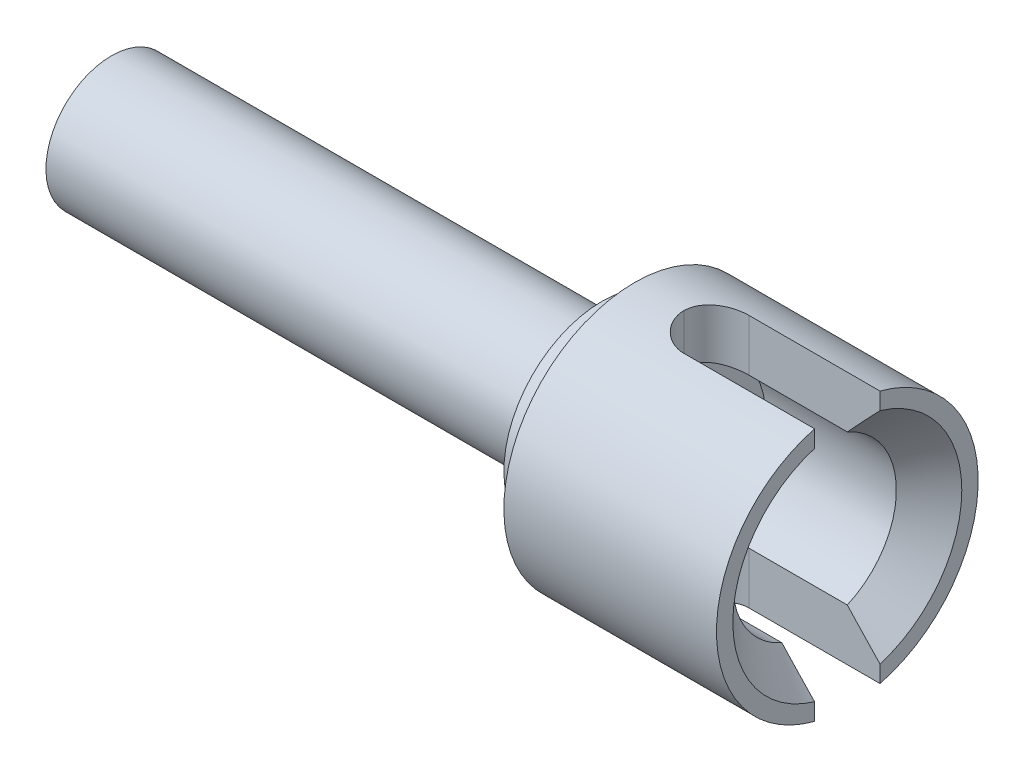
ISO-10303-21;
HEADER;
FILE_DESCRIPTION(('STEP AP214'),'2;1');
FILE_NAME('part.step','',(''),(''),'','','');
FILE_SCHEMA(('AUTOMOTIVE_DESIGN { 1 0 10303 214 1 1 1 1 }'));
ENDSEC;
DATA;
#1=APPLICATION_CONTEXT('core data for automotive mechanical design processes');
#2=APPLICATION_PROTOCOL_DEFINITION('international standard','automotive_design',2000,#1);
#3=PRODUCT_CONTEXT('',#1,'mechanical');
#4=PRODUCT('Part','Part','',(#3));
#5=PRODUCT_RELATED_PRODUCT_CATEGORY('part','',(#4));
#6=PRODUCT_DEFINITION_FORMATION('','',#4);
#7=PRODUCT_DEFINITION_CONTEXT('part definition',#1,'design');
#8=PRODUCT_DEFINITION('design','',#6,#7);
#9=PRODUCT_DEFINITION_SHAPE('','',#8);
#10=(LENGTH_UNIT() NAMED_UNIT(*) SI_UNIT(.MILLI.,.METRE.));
#11=(NAMED_UNIT(*) PLANE_ANGLE_UNIT() SI_UNIT($,.RADIAN.));
#12=(NAMED_UNIT(*) SI_UNIT($,.STERADIAN.) SOLID_ANGLE_UNIT());
#13=UNCERTAINTY_MEASURE_WITH_UNIT(LENGTH_MEASURE(1.E-05),#10,'distance_accuracy_value','');
#14=(GEOMETRIC_REPRESENTATION_CONTEXT(3) GLOBAL_UNCERTAINTY_ASSIGNED_CONTEXT((#13)) GLOBAL_UNIT_ASSIGNED_CONTEXT((#10,
#11,#12)) REPRESENTATION_CONTEXT('',''));
#15=CARTESIAN_POINT('',(0.,0.,0.));
#16=DIRECTION('',(0.,0.,1.));
#17=DIRECTION('',(1.,0.,0.));
#18=AXIS2_PLACEMENT_3D('',#15,#16,#17);
#19=CARTESIAN_POINT('',(0.,0.,0.));
#20=DIRECTION('',(1.,0.,0.));
#21=DIRECTION('',(0.,1.,0.));
#22=AXIS2_PLACEMENT_3D('',#19,#20,#21);
#23=CYLINDRICAL_SURFACE('',#22,3.96875);
#24=DIRECTION('',(1.,0.,0.));
#25=VECTOR('',#24,1.);
#26=CARTESIAN_POINT('',(0.,-3.6374194578712,-1.5875));
#27=LINE('',#26,#25);
#28=CARTESIAN_POINT('',(3.96875,-3.6374194578712,-1.5875));
#29=VERTEX_POINT('',#28);
#30=CARTESIAN_POINT('',(8.73125,-3.6374194578712,-1.5875));
#31=VERTEX_POINT('',#30);
#32=EDGE_CURVE('E378',#29,#31,#27,.T.);
#33=ORIENTED_EDGE('',*,*,#32,.T.);
#34=CARTESIAN_POINT('',(8.73125,0.,0.));
#35=DIRECTION('',(-1.,0.,0.));
#36=DIRECTION('',(0.,-1.,0.));
#37=AXIS2_PLACEMENT_3D('',#34,#35,#36);
#38=CIRCLE('',#37,3.96875);
#39=CARTESIAN_POINT('',(8.73125,3.6374194578712,-1.5875));
#40=VERTEX_POINT('',#39);
#41=EDGE_CURVE('E319',#31,#40,#38,.F.);
#42=ORIENTED_EDGE('',*,*,#41,.T.);
#43=DIRECTION('',(1.,0.,0.));
#44=VECTOR('',#43,1.);
#45=CARTESIAN_POINT('',(0.,3.6374194578712,-1.5875));
#46=LINE('',#45,#44);
#47=CARTESIAN_POINT('',(3.96875,3.6374194578712,-1.5875));
#48=VERTEX_POINT('',#47);
#49=EDGE_CURVE('E377',#40,#48,#46,.F.);
#50=ORIENTED_EDGE('',*,*,#49,.T.);
#51=CARTESIAN_POINT('',(3.96875,3.6374194578712,-1.5875));
#52=CARTESIAN_POINT('',(3.92602810243465,3.63741383962096,-1.58750184812125));
#53=CARTESIAN_POINT('',(3.88332875869303,3.63817306486479,-1.58577432279343));
#54=CARTESIAN_POINT('',(3.79827459184285,3.64116511612365,-1.57889657712954));
#55=CARTESIAN_POINT('',(3.75591964368906,3.64339738067565,-1.57374766088416));
#56=CARTESIAN_POINT('',(3.6301813006015,3.65219188533386,-1.55328759601412));
#57=CARTESIAN_POINT('',(3.54770244852725,3.6608529363275,-1.53296229854883));
#58=CARTESIAN_POINT('',(3.38771317198106,3.68267853067419,-1.47975273463246));
#59=CARTESIAN_POINT('',(3.31019777157339,3.69583847715174,-1.44688128359683));
#60=CARTESIAN_POINT('',(3.16168861789508,3.72516580069995,-1.36960620090599));
#61=CARTESIAN_POINT('',(3.09070141677396,3.74133615104774,-1.3251911506894));
#62=CARTESIAN_POINT('',(2.95333133987929,3.77587660433763,-1.22342125957965));
#63=CARTESIAN_POINT('',(2.8873713436787,3.79431699293091,-1.16551959183532));
#64=CARTESIAN_POINT('',(2.76579244450964,3.83073862499475,-1.03957293948962));
#65=CARTESIAN_POINT('',(2.71017590752935,3.84871976260567,-0.971525640549356));
#66=CARTESIAN_POINT('',(2.60871506921386,3.88305820620028,-0.823891813808964));
#67=CARTESIAN_POINT('',(2.56334886385573,3.89932217227142,-0.743953356852592));
#68=CARTESIAN_POINT('',(2.48691833069168,3.9275159204731,-0.576846311618418));
#69=CARTESIAN_POINT('',(2.45583777186154,3.93945061815173,-0.489686062187027));
#70=CARTESIAN_POINT('',(2.41558822057406,3.95510835037269,-0.335207512549659));
#71=CARTESIAN_POINT('',(2.4027552754563,3.96018317246006,-0.268959916670227));
#72=CARTESIAN_POINT('',(2.38556826068598,3.96702274934214,-0.135159667180418));
#73=CARTESIAN_POINT('',(2.38122051324627,3.96878503597282,-0.0676060783084545));
#74=CARTESIAN_POINT('',(2.38125,3.96875,0.));
#75=B_SPLINE_CURVE_WITH_KNOTS('',3,(#51,#52,#53,#54,#55,#56,#57,#58,#59,#60,#61,#62,#63,#64,#65,
#66,#67,#68,#69,#70,#71,#72,#73,#74),.UNSPECIFIED.,.F.,.F.,(4,2,2,2,2,2,2,2,2,2,2,4),(0.,
0.128080398698314,0.256112006503549,0.510926642824228,0.765481689339862,1.02028949833636,
1.28816597634386,1.55610365391027,1.83472528824556,2.1130295717501,2.3154412151602,
2.51800361542009),.UNSPECIFIED.);
#76=CARTESIAN_POINT('',(2.38125,3.96875,0.));
#77=VERTEX_POINT('',#76);
#78=EDGE_CURVE('E311',#48,#77,#75,.T.);
#79=ORIENTED_EDGE('',*,*,#78,.T.);
#80=CARTESIAN_POINT('',(2.38125,0.,0.));
#81=DIRECTION('',(1.,0.,0.));
#82=DIRECTION('',(0.,1.,0.));
#83=AXIS2_PLACEMENT_3D('',#80,#81,#82);
#84=CIRCLE('',#83,3.96875);
#85=CARTESIAN_POINT('',(2.38125,-3.96875,0.));
#86=VERTEX_POINT('',#85);
#87=EDGE_CURVE('E185',#86,#77,#84,.T.);
#88=ORIENTED_EDGE('',*,*,#87,.F.);
#89=CARTESIAN_POINT('',(2.38125,-3.96875,0.));
#90=CARTESIAN_POINT('',(2.38124851790412,-3.96875369516103,-0.0428607001451946));
#91=CARTESIAN_POINT('',(2.38298693483415,-3.96805488344218,-0.0856993556853991));
#92=CARTESIAN_POINT('',(2.38991045081292,-3.96529188571283,-0.171040382183681));
#93=CARTESIAN_POINT('',(2.3950945284199,-3.96322810433883,-0.213542849025273));
#94=CARTESIAN_POINT('',(2.41570683559488,-3.95507196393478,-0.33977664728298));
#95=CARTESIAN_POINT('',(2.43619582781275,-3.94701410018382,-0.422614387160559));
#96=CARTESIAN_POINT('',(2.48988075452175,-3.92648272405839,-0.583344848198205));
#97=CARTESIAN_POINT('',(2.52306836379832,-3.91401210508868,-0.66124077029055));
#98=CARTESIAN_POINT('',(2.60108469387746,-3.88587265499136,-0.810392331117243));
#99=CARTESIAN_POINT('',(2.64592212343718,-3.87020143315429,-0.881642947809557));
#100=CARTESIAN_POINT('',(2.74815065020465,-3.83643853017265,-1.01878220140519));
#101=CARTESIAN_POINT('',(2.80599332819521,-3.81827240559974,-1.08431551324055));
#102=CARTESIAN_POINT('',(2.93164012097266,-3.78190483541745,-1.20505386735368));
#103=CARTESIAN_POINT('',(2.9994485860561,-3.76370337782587,-1.26025437507542));
#104=CARTESIAN_POINT('',(3.14679708956617,-3.72841676012464,-1.36120480857947));
#105=CARTESIAN_POINT('',(3.22672776891809,-3.7114187071445,-1.4064175944854));
#106=CARTESIAN_POINT('',(3.39379414047564,-3.681666742486,-1.48256038380695));
#107=CARTESIAN_POINT('',(3.48091970578923,-3.6689069883162,-1.51351007189968));
#108=CARTESIAN_POINT('',(3.63506055428717,-3.65212863509287,-1.55347251642303));
#109=CARTESIAN_POINT('',(3.70097950525157,-3.64666886628739,-1.56618395241635));
#110=CARTESIAN_POINT('',(3.83416144805477,-3.63928843788904,-1.5832179371524));
#111=CARTESIAN_POINT('',(3.90142593644765,-3.63737196913539,-1.58753055250852));
#112=CARTESIAN_POINT('',(3.96875,-3.6374194578712,-1.5875));
#113=B_SPLINE_CURVE_WITH_KNOTS('',3,(#89,#90,#91,#92,#93,#94,#95,#96,#97,#98,#99,#100,#101,#102,
#103,#104,#105,#106,#107,#108,#109,#110,#111,#112),.UNSPECIFIED.,.F.,.F.,(4,2,2,2,2,2,2,2,2,2,2,
4),(0.,0.128498216049018,0.256958356688971,0.51275394239543,0.768382115034419,1.02420193363494,
1.290865946481,1.55764671199365,1.83643414135596,2.11483565193651,2.31630002858557,
2.51800253522898),.UNSPECIFIED.);
#114=EDGE_CURVE('E236',#86,#29,#113,.T.);
#115=ORIENTED_EDGE('',*,*,#114,.T.);
#116=EDGE_LOOP('',(#33,#42,#50,#79,#88,#115));
#117=FACE_BOUND('',#116,.T.);
#118=ADVANCED_FACE('F50',(#117),#23,.F.);
#119=CARTESIAN_POINT('',(10.31875,0.,0.));
#120=DIRECTION('',(-1.,0.,0.));
#121=DIRECTION('',(0.,-1.,0.));
#122=AXIS2_PLACEMENT_3D('',#119,#120,#121);
#123=PLANE('',#122);
#124=DIRECTION('',(0.,1.,0.));
#125=VECTOR('',#124,1.);
#126=CARTESIAN_POINT('',(10.31875,-6.35,-1.5875));
#127=LINE('',#126,#125);
#128=CARTESIAN_POINT('',(10.31875,5.32463687142138,-1.5875));
#129=VERTEX_POINT('',#128);
#130=CARTESIAN_POINT('',(10.31875,6.14836106210428,-1.5875));
#131=VERTEX_POINT('',#130);
#132=EDGE_CURVE('E179',#129,#131,#127,.T.);
#133=ORIENTED_EDGE('',*,*,#132,.F.);
#134=CARTESIAN_POINT('',(10.31875,0.,0.));
#135=DIRECTION('',(-1.,0.,0.));
#136=DIRECTION('',(0.,-1.,0.));
#137=AXIS2_PLACEMENT_3D('',#134,#135,#136);
#138=CIRCLE('',#137,5.55625000000001);
#139=CARTESIAN_POINT('',(10.31875,-5.32463687142138,-1.5875));
#140=VERTEX_POINT('',#139);
#141=EDGE_CURVE('E338',#129,#140,#138,.T.);
#142=ORIENTED_EDGE('',*,*,#141,.T.);
#143=CARTESIAN_POINT('',(10.31875,-6.14836106210428,-1.5875));
#144=VERTEX_POINT('',#143);
#145=EDGE_CURVE('E369',#144,#140,#127,.T.);
#146=ORIENTED_EDGE('',*,*,#145,.F.);
#147=CARTESIAN_POINT('',(10.31875,0.,0.));
#148=DIRECTION('',(1.,0.,0.));
#149=DIRECTION('',(0.,1.,0.));
#150=AXIS2_PLACEMENT_3D('',#147,#148,#149);
#151=CIRCLE('',#150,6.35);
#152=EDGE_CURVE('E186',#144,#131,#151,.T.);
#153=ORIENTED_EDGE('',*,*,#152,.T.);
#154=EDGE_LOOP('',(#133,#142,#146,#153));
#155=FACE_BOUND('',#154,.T.);
#156=ADVANCED_FACE('F405',(#155),#123,.F.);
#157=CARTESIAN_POINT('',(0.,0.,0.));
#158=DIRECTION('',(1.,0.,0.));
#159=DIRECTION('',(0.,1.,0.));
#160=AXIS2_PLACEMENT_3D('',#157,#158,#159);
#161=CYLINDRICAL_SURFACE('',#160,6.35);
#162=CARTESIAN_POINT('',(0.,0.,0.));
#163=DIRECTION('',(1.,0.,0.));
#164=DIRECTION('',(0.,1.,0.));
#165=AXIS2_PLACEMENT_3D('',#162,#163,#164);
#166=CIRCLE('',#165,6.35);
#167=CARTESIAN_POINT('',(0.,6.35,0.));
#168=VERTEX_POINT('',#167);
#169=EDGE_CURVE('E193',#168,#168,#166,.T.);
#170=ORIENTED_EDGE('',*,*,#169,.T.);
#171=EDGE_LOOP('',(#170));
#172=FACE_BOUND('',#171,.T.);
#173=DIRECTION('',(1.,0.,0.));
#174=VECTOR('',#173,1.);
#175=CARTESIAN_POINT('',(0.,6.14836106210428,-1.5875));
#176=LINE('',#175,#174);
#177=CARTESIAN_POINT('',(3.96875,6.14836106210428,-1.5875));
#178=VERTEX_POINT('',#177);
#179=EDGE_CURVE('E173',#131,#178,#176,.F.);
#180=ORIENTED_EDGE('',*,*,#179,.F.);
#181=ORIENTED_EDGE('',*,*,#152,.F.);
#182=DIRECTION('',(1.,0.,0.));
#183=VECTOR('',#182,1.);
#184=CARTESIAN_POINT('',(0.,-6.14836106210428,-1.5875));
#185=LINE('',#184,#183);
#186=CARTESIAN_POINT('',(3.96875,-6.14836106210428,-1.5875));
#187=VERTEX_POINT('',#186);
#188=EDGE_CURVE('E174',#187,#144,#185,.T.);
#189=ORIENTED_EDGE('',*,*,#188,.F.);
#190=CARTESIAN_POINT('',(3.96875,-6.14836106210428,-1.5875));
#191=CARTESIAN_POINT('',(3.92483359574141,-6.14835810796606,-1.58750053563076));
#192=CARTESIAN_POINT('',(3.88093895137328,-6.1488321882052,-1.58567649135611));
#193=CARTESIAN_POINT('',(3.79347796767349,-6.15070388893621,-1.57840509610179));
#194=CARTESIAN_POINT('',(3.74991157430941,-6.15210135391809,-1.57295835523029));
#195=CARTESIAN_POINT('',(3.62036259143335,-6.15762251223385,-1.55126429791882));
#196=CARTESIAN_POINT('',(3.53527018927444,-6.16307532290946,-1.52966278974207));
#197=CARTESIAN_POINT('',(3.37006582243951,-6.17688972981619,-1.47287988261591));
#198=CARTESIAN_POINT('',(3.28995347620758,-6.18525110287803,-1.43769952552689));
#199=CARTESIAN_POINT('',(3.13672525829143,-6.20393595252303,-1.35479829949003));
#200=CARTESIAN_POINT('',(3.06361148021027,-6.2142600134982,-1.30707369385797));
#201=CARTESIAN_POINT('',(2.92490015578896,-6.23595799608254,-1.19933256749028));
#202=CARTESIAN_POINT('',(2.85947866574726,-6.24734856924931,-1.13909280637801));
#203=CARTESIAN_POINT('',(2.7395469754307,-6.26975322519149,-1.0085018185416));
#204=CARTESIAN_POINT('',(2.68503884552563,-6.2807672362014,-0.938148677552538));
#205=CARTESIAN_POINT('',(2.58775247205585,-6.30136480507554,-0.788105723384307));
#206=CARTESIAN_POINT('',(2.54515208556795,-6.31092579003165,-0.708297348786836));
#207=CARTESIAN_POINT('',(2.47406156240866,-6.3273403202671,-0.542394374747512));
#208=CARTESIAN_POINT('',(2.44556051978103,-6.33419595732182,-0.456304693284594));
#209=CARTESIAN_POINT('',(2.41020807405795,-6.34280700011213,-0.308130870380592));
#210=CARTESIAN_POINT('',(2.3993655520536,-6.34548862203841,-0.247023133427682));
#211=CARTESIAN_POINT('',(2.38488205167632,-6.34909193923034,-0.123954377077036));
#212=CARTESIAN_POINT('',(2.38123594177495,-6.35001488853225,-0.0619939974411772));
#213=CARTESIAN_POINT('',(2.38125,-6.35,0.));
#214=B_SPLINE_CURVE_WITH_KNOTS('',3,(#190,#191,#192,#193,#194,#195,#196,#197,#198,#199,#200,
#201,#202,#203,#204,#205,#206,#207,#208,#209,#210,#211,#212,#213),.UNSPECIFIED.,.F.,.F.,(4,2,2,
2,2,2,2,2,2,2,2,4),(0.,0.13166598487826,0.26330980114286,0.525827589053102,0.788325238840122,
1.05090117028931,1.31864004112946,1.58642965659115,1.8580279681483,2.12941586644515,
2.31535338877351,2.50115827710588),.UNSPECIFIED.);
#215=CARTESIAN_POINT('',(2.38125,-6.35,0.));
#216=VERTEX_POINT('',#215);
#217=EDGE_CURVE('E245',#187,#216,#214,.T.);
#218=ORIENTED_EDGE('',*,*,#217,.T.);
#219=CARTESIAN_POINT('',(2.38125,-6.35,0.));
#220=CARTESIAN_POINT('',(2.38124952268289,-6.35000250540312,0.0439381419439145));
#221=CARTESIAN_POINT('',(2.38307531831141,-6.34954340403385,0.0878545966592351));
#222=CARTESIAN_POINT('',(2.390354068651,-6.3477286591364,0.175360439570218));
#223=CARTESIAN_POINT('',(2.39580645883683,-6.34637315514479,0.218949877602367));
#224=CARTESIAN_POINT('',(2.41752498623497,-6.34101201422057,0.34857618129887));
#225=CARTESIAN_POINT('',(2.43915282195388,-6.33571144551056,0.433724473320642));
#226=CARTESIAN_POINT('',(2.49601231471049,-6.32222636565126,0.599043829778521));
#227=CARTESIAN_POINT('',(2.53124369810381,-6.31404191251351,0.679214994295193));
#228=CARTESIAN_POINT('',(2.61426426878136,-6.29566048497806,0.832540768645135));
#229=CARTESIAN_POINT('',(2.66205673278726,-6.28546298562404,0.905693540832323));
#230=CARTESIAN_POINT('',(2.76986778510801,-6.26393073756775,1.0443626413639));
#231=CARTESIAN_POINT('',(2.83009429334061,-6.25257857860382,1.1097145404664));
#232=CARTESIAN_POINT('',(2.96062985433904,-6.23013032507566,1.22951149389981));
#233=CARTESIAN_POINT('',(3.03094113399481,-6.21903428769736,1.28395413289799));
#234=CARTESIAN_POINT('',(3.18094397253101,-6.19817637949513,1.3811687665937));
#235=CARTESIAN_POINT('',(3.26076136908793,-6.18843723686723,1.42375170417231));
#236=CARTESIAN_POINT('',(3.42668191006407,-6.17166052854814,1.49480670969855));
#237=CARTESIAN_POINT('',(3.51277990734533,-6.164620779582,1.52329018676586));
#238=CARTESIAN_POINT('',(3.6609060463689,-6.15576968025138,1.55859600850025));
#239=CARTESIAN_POINT('',(3.72195378400178,-6.15300939882428,1.56941770251178));
#240=CARTESIAN_POINT('',(3.84490665813771,-6.14929724452326,1.58387443533482));
#241=CARTESIAN_POINT('',(3.90681120670851,-6.14834418804682,1.58751417787204));
#242=CARTESIAN_POINT('',(3.96875,-6.14836106210428,1.5875));
#243=B_SPLINE_CURVE_WITH_KNOTS('',3,(#219,#220,#221,#222,#223,#224,#225,#226,#227,#228,#229,
#230,#231,#232,#233,#234,#235,#236,#237,#238,#239,#240,#241,#242),.UNSPECIFIED.,.F.,.F.,(4,2,2,
2,2,2,2,2,2,2,2,4),(0.,0.131731399473639,0.263442298089414,0.526113689422091,0.788779797220858,
1.05151449302482,1.31906192516595,1.58666852757008,1.85832436810619,2.1297600270756,
2.31551982828807,2.50115792810002),.UNSPECIFIED.);
#244=CARTESIAN_POINT('',(3.96875,-6.14836106210428,1.5875));
#245=VERTEX_POINT('',#244);
#246=EDGE_CURVE('E170',#216,#245,#243,.T.);
#247=ORIENTED_EDGE('',*,*,#246,.T.);
#248=DIRECTION('',(1.,0.,0.));
#249=VECTOR('',#248,1.);
#250=CARTESIAN_POINT('',(0.,-6.14836106210428,1.5875));
#251=LINE('',#250,#249);
#252=CARTESIAN_POINT('',(10.31875,-6.14836106210428,1.5875));
#253=VERTEX_POINT('',#252);
#254=EDGE_CURVE('E163',#245,#253,#251,.T.);
#255=ORIENTED_EDGE('',*,*,#254,.T.);
#256=CARTESIAN_POINT('',(10.31875,6.14836106210428,1.5875));
#257=VERTEX_POINT('',#256);
#258=EDGE_CURVE('E168',#257,#253,#151,.T.);
#259=ORIENTED_EDGE('',*,*,#258,.F.);
#260=DIRECTION('',(1.,0.,0.));
#261=VECTOR('',#260,1.);
#262=CARTESIAN_POINT('',(0.,6.14836106210428,1.5875));
#263=LINE('',#262,#261);
#264=CARTESIAN_POINT('',(3.96875,6.14836106210428,1.5875));
#265=VERTEX_POINT('',#264);
#266=EDGE_CURVE('E213',#257,#265,#263,.F.);
#267=ORIENTED_EDGE('',*,*,#266,.T.);
#268=CARTESIAN_POINT('',(3.96875,6.14836106210428,1.5875));
#269=CARTESIAN_POINT('',(3.92483359574141,6.14835810796606,1.58750053563076));
#270=CARTESIAN_POINT('',(3.88093895137328,6.1488321882052,1.58567649135611));
#271=CARTESIAN_POINT('',(3.79347796767349,6.15070388893621,1.57840509610179));
#272=CARTESIAN_POINT('',(3.74991157430941,6.15210135391809,1.57295835523029));
#273=CARTESIAN_POINT('',(3.62036259143335,6.15762251223385,1.55126429791882));
#274=CARTESIAN_POINT('',(3.53527018927444,6.16307532290946,1.52966278974207));
#275=CARTESIAN_POINT('',(3.37006582243951,6.17688972981619,1.47287988261591));
#276=CARTESIAN_POINT('',(3.28995347620758,6.18525110287803,1.43769952552689));
#277=CARTESIAN_POINT('',(3.13672525829143,6.20393595252303,1.35479829949003));
#278=CARTESIAN_POINT('',(3.06361148021027,6.2142600134982,1.30707369385798));
#279=CARTESIAN_POINT('',(2.92490015578896,6.23595799608254,1.19933256749028));
#280=CARTESIAN_POINT('',(2.85947866574726,6.24734856924931,1.13909280637801));
#281=CARTESIAN_POINT('',(2.7395469754307,6.26975322519149,1.0085018185416));
#282=CARTESIAN_POINT('',(2.68503884552563,6.2807672362014,0.938148677552538));
#283=CARTESIAN_POINT('',(2.58775247205585,6.30136480507555,0.788105723384308));
#284=CARTESIAN_POINT('',(2.54515208556794,6.31092579003165,0.708297348786836));
#285=CARTESIAN_POINT('',(2.47406156240866,6.3273403202671,0.542394374747513));
#286=CARTESIAN_POINT('',(2.44556051978103,6.33419595732182,0.456304693284594));
#287=CARTESIAN_POINT('',(2.41020807405795,6.34280700011213,0.308130870380593));
#288=CARTESIAN_POINT('',(2.3993655520536,6.34548862203841,0.247023133427683));
#289=CARTESIAN_POINT('',(2.38488205167632,6.34909193923034,0.123954377077037));
#290=CARTESIAN_POINT('',(2.38123594177495,6.35001488853225,0.0619939974411775));
#291=CARTESIAN_POINT('',(2.38125,6.35,0.));
#292=B_SPLINE_CURVE_WITH_KNOTS('',3,(#268,#269,#270,#271,#272,#273,#274,#275,#276,#277,#278,
#279,#280,#281,#282,#283,#284,#285,#286,#287,#288,#289,#290,#291),.UNSPECIFIED.,.F.,.F.,(4,2,2,
2,2,2,2,2,2,2,2,4),(0.,0.131665984878259,0.26330980114286,0.525827589053102,0.788325238840121,
1.05090117028931,1.31864004112946,1.58642965659115,1.8580279681483,2.12941586644515,
2.31535338877351,2.50115827710588),.UNSPECIFIED.);
#293=CARTESIAN_POINT('',(2.38125,6.35,0.));
#294=VERTEX_POINT('',#293);
#295=EDGE_CURVE('E286',#265,#294,#292,.T.);
#296=ORIENTED_EDGE('',*,*,#295,.T.);
#297=CARTESIAN_POINT('',(2.38125,6.35,0.));
#298=CARTESIAN_POINT('',(2.38124952268289,6.35000250540312,-0.0439381419439145));
#299=CARTESIAN_POINT('',(2.38307531831141,6.34954340403385,-0.087854596659235));
#300=CARTESIAN_POINT('',(2.390354068651,6.3477286591364,-0.175360439570218));
#301=CARTESIAN_POINT('',(2.39580645883683,6.34637315514479,-0.218949877602367));
#302=CARTESIAN_POINT('',(2.41752498623497,6.34101201422057,-0.34857618129887));
#303=CARTESIAN_POINT('',(2.43915282195388,6.33571144551056,-0.433724473320642));
#304=CARTESIAN_POINT('',(2.49601231471049,6.32222636565126,-0.599043829778521));
#305=CARTESIAN_POINT('',(2.53124369810381,6.31404191251351,-0.679214994295193));
#306=CARTESIAN_POINT('',(2.61426426878136,6.29566048497806,-0.832540768645135));
#307=CARTESIAN_POINT('',(2.66205673278726,6.28546298562404,-0.905693540832323));
#308=CARTESIAN_POINT('',(2.76986778510801,6.26393073756775,-1.0443626413639));
#309=CARTESIAN_POINT('',(2.83009429334061,6.25257857860382,-1.1097145404664));
#310=CARTESIAN_POINT('',(2.96062985433904,6.23013032507566,-1.22951149389981));
#311=CARTESIAN_POINT('',(3.03094113399481,6.21903428769736,-1.28395413289799));
#312=CARTESIAN_POINT('',(3.18094397253101,6.19817637949513,-1.3811687665937));
#313=CARTESIAN_POINT('',(3.26076136908793,6.18843723686723,-1.42375170417231));
#314=CARTESIAN_POINT('',(3.42668191006407,6.17166052854814,-1.49480670969855));
#315=CARTESIAN_POINT('',(3.51277990734533,6.164620779582,-1.52329018676586));
#316=CARTESIAN_POINT('',(3.6609060463689,6.15576968025138,-1.55859600850025));
#317=CARTESIAN_POINT('',(3.72195378400178,6.15300939882428,-1.56941770251178));
#318=CARTESIAN_POINT('',(3.84490665813771,6.14929724452326,-1.58387443533482));
#319=CARTESIAN_POINT('',(3.90681120670851,6.14834418804682,-1.58751417787204));
#320=CARTESIAN_POINT('',(3.96875,6.14836106210428,-1.5875));
#321=B_SPLINE_CURVE_WITH_KNOTS('',3,(#297,#298,#299,#300,#301,#302,#303,#304,#305,#306,#307,
#308,#309,#310,#311,#312,#313,#314,#315,#316,#317,#318,#319,#320),.UNSPECIFIED.,.F.,.F.,(4,2,2,
2,2,2,2,2,2,2,2,4),(0.,0.131731399473639,0.263442298089414,0.526113689422091,0.788779797220858,
1.05151449302482,1.31906192516595,1.58666852757008,1.85832436810619,2.1297600270756,
2.31551982828807,2.50115792810002),.UNSPECIFIED.);
#322=EDGE_CURVE('E285',#294,#178,#321,.T.);
#323=ORIENTED_EDGE('',*,*,#322,.T.);
#324=EDGE_LOOP('',(#180,#181,#189,#218,#247,#255,#259,#267,#296,#323));
#325=FACE_BOUND('',#324,.T.);
#326=ADVANCED_FACE('F165',(#172,#325),#161,.T.);
#327=CARTESIAN_POINT('',(0.,0.,0.));
#328=DIRECTION('',(1.,0.,0.));
#329=DIRECTION('',(0.,1.,0.));
#330=AXIS2_PLACEMENT_3D('',#327,#328,#329);
#331=PLANE('',#330);
#332=ORIENTED_EDGE('',*,*,#169,.F.);
#333=EDGE_LOOP('',(#332));
#334=FACE_BOUND('',#333,.T.);
#335=CARTESIAN_POINT('',(0.,0.,0.));
#336=DIRECTION('',(1.,0.,0.));
#337=DIRECTION('',(0.,1.,0.));
#338=AXIS2_PLACEMENT_3D('',#335,#336,#337);
#339=CIRCLE('',#338,4.7625);
#340=CARTESIAN_POINT('',(0.,4.7625,0.));
#341=VERTEX_POINT('',#340);
#342=EDGE_CURVE('E209',#341,#341,#339,.T.);
#343=ORIENTED_EDGE('',*,*,#342,.T.);
#344=EDGE_LOOP('',(#343));
#345=FACE_BOUND('',#344,.T.);
#346=ADVANCED_FACE('F437',(#334,#345),#331,.F.);
#347=CARTESIAN_POINT('',(0.,0.,0.));
#348=DIRECTION('',(1.,0.,0.));
#349=DIRECTION('',(0.,1.,0.));
#350=AXIS2_PLACEMENT_3D('',#347,#348,#349);
#351=CYLINDRICAL_SURFACE('',#350,4.7625);
#352=CARTESIAN_POINT('',(-1.5875,0.,0.));
#353=DIRECTION('',(1.,0.,0.));
#354=DIRECTION('',(0.,1.,0.));
#355=AXIS2_PLACEMENT_3D('',#352,#353,#354);
#356=CIRCLE('',#355,4.7625);
#357=CARTESIAN_POINT('',(-1.5875,4.7625,0.));
#358=VERTEX_POINT('',#357);
#359=EDGE_CURVE('E205',#358,#358,#356,.T.);
#360=ORIENTED_EDGE('',*,*,#359,.T.);
#361=EDGE_LOOP('',(#360));
#362=FACE_BOUND('',#361,.T.);
#363=ORIENTED_EDGE('',*,*,#342,.F.);
#364=EDGE_LOOP('',(#363));
#365=FACE_BOUND('',#364,.T.);
#366=ADVANCED_FACE('F554',(#362,#365),#351,.T.);
#367=CARTESIAN_POINT('',(-1.5875,0.,0.));
#368=DIRECTION('',(1.,0.,0.));
#369=DIRECTION('',(0.,1.,0.));
#370=AXIS2_PLACEMENT_3D('',#367,#368,#369);
#371=PLANE('',#370);
#372=ORIENTED_EDGE('',*,*,#359,.F.);
#373=EDGE_LOOP('',(#372));
#374=FACE_BOUND('',#373,.T.);
#375=CARTESIAN_POINT('',(-1.5875,0.,0.));
#376=DIRECTION('',(1.,0.,0.));
#377=DIRECTION('',(0.,1.,0.));
#378=AXIS2_PLACEMENT_3D('',#375,#376,#377);
#379=CIRCLE('',#378,3.175);
#380=CARTESIAN_POINT('',(-1.5875,3.175,0.));
#381=VERTEX_POINT('',#380);
#382=EDGE_CURVE('E201',#381,#381,#379,.T.);
#383=ORIENTED_EDGE('',*,*,#382,.T.);
#384=EDGE_LOOP('',(#383));
#385=FACE_BOUND('',#384,.T.);
#386=ADVANCED_FACE('F544',(#374,#385),#371,.F.);
#387=CARTESIAN_POINT('',(0.,0.,0.));
#388=DIRECTION('',(1.,0.,0.));
#389=DIRECTION('',(0.,1.,0.));
#390=AXIS2_PLACEMENT_3D('',#387,#388,#389);
#391=CYLINDRICAL_SURFACE('',#390,3.175);
#392=CARTESIAN_POINT('',(-25.4,0.,0.));
#393=DIRECTION('',(1.,0.,0.));
#394=DIRECTION('',(0.,1.,0.));
#395=AXIS2_PLACEMENT_3D('',#392,#393,#394);
#396=CIRCLE('',#395,3.175);
#397=CARTESIAN_POINT('',(-25.4,3.175,0.));
#398=VERTEX_POINT('',#397);
#399=EDGE_CURVE('E198',#398,#398,#396,.T.);
#400=ORIENTED_EDGE('',*,*,#399,.T.);
#401=EDGE_LOOP('',(#400));
#402=FACE_BOUND('',#401,.T.);
#403=ORIENTED_EDGE('',*,*,#382,.F.);
#404=EDGE_LOOP('',(#403));
#405=FACE_BOUND('',#404,.T.);
#406=ADVANCED_FACE('F534',(#402,#405),#391,.T.);
#407=CARTESIAN_POINT('',(-25.4,0.,0.));
#408=DIRECTION('',(1.,0.,0.));
#409=DIRECTION('',(0.,1.,0.));
#410=AXIS2_PLACEMENT_3D('',#407,#408,#409);
#411=PLANE('',#410);
#412=ORIENTED_EDGE('',*,*,#399,.F.);
#413=EDGE_LOOP('',(#412));
#414=FACE_BOUND('',#413,.T.);
#415=ADVANCED_FACE('F517',(#414),#411,.F.);
#416=CARTESIAN_POINT('',(2.38125,0.,0.));
#417=DIRECTION('',(1.,0.,0.));
#418=DIRECTION('',(0.,1.,0.));
#419=AXIS2_PLACEMENT_3D('',#416,#417,#418);
#420=PLANE('',#419);
#421=EDGE_CURVE('E189',#77,#86,#84,.T.);
#422=ORIENTED_EDGE('',*,*,#421,.T.);
#423=ORIENTED_EDGE('',*,*,#87,.T.);
#424=EDGE_LOOP('',(#422,#423));
#425=FACE_BOUND('',#424,.T.);
#426=ADVANCED_FACE('F261',(#425),#420,.T.);
#427=DIRECTION('',(1.,0.,0.));
#428=VECTOR('',#427,1.);
#429=CARTESIAN_POINT('',(0.,3.6374194578712,1.5875));
#430=LINE('',#429,#428);
#431=CARTESIAN_POINT('',(8.73125,3.6374194578712,1.5875));
#432=VERTEX_POINT('',#431);
#433=CARTESIAN_POINT('',(3.96875,3.6374194578712,1.5875));
#434=VERTEX_POINT('',#433);
#435=EDGE_CURVE('E367',#432,#434,#430,.F.);
#436=ORIENTED_EDGE('',*,*,#435,.F.);
#437=CARTESIAN_POINT('',(8.73125,0.,0.));
#438=DIRECTION('',(-1.,0.,0.));
#439=DIRECTION('',(0.,-1.,0.));
#440=AXIS2_PLACEMENT_3D('',#437,#438,#439);
#441=CIRCLE('',#440,3.96875);
#442=CARTESIAN_POINT('',(8.73125,-3.6374194578712,1.5875));
#443=VERTEX_POINT('',#442);
#444=EDGE_CURVE('E355',#432,#443,#441,.F.);
#445=ORIENTED_EDGE('',*,*,#444,.T.);
#446=DIRECTION('',(1.,0.,0.));
#447=VECTOR('',#446,1.);
#448=CARTESIAN_POINT('',(0.,-3.6374194578712,1.5875));
#449=LINE('',#448,#447);
#450=CARTESIAN_POINT('',(3.96875,-3.6374194578712,1.5875));
#451=VERTEX_POINT('',#450);
#452=EDGE_CURVE('E368',#451,#443,#449,.T.);
#453=ORIENTED_EDGE('',*,*,#452,.F.);
#454=CARTESIAN_POINT('',(3.96875,-3.6374194578712,1.5875));
#455=CARTESIAN_POINT('',(3.92602810243465,-3.63741383962096,1.58750184812125));
#456=CARTESIAN_POINT('',(3.88332875869303,-3.63817306486479,1.58577432279343));
#457=CARTESIAN_POINT('',(3.79827459184285,-3.64116511612365,1.57889657712954));
#458=CARTESIAN_POINT('',(3.75591964368906,-3.64339738067565,1.57374766088416));
#459=CARTESIAN_POINT('',(3.6301813006015,-3.65219188533386,1.55328759601412));
#460=CARTESIAN_POINT('',(3.54770244852725,-3.6608529363275,1.53296229854883));
#461=CARTESIAN_POINT('',(3.38771317198106,-3.68267853067419,1.47975273463246));
#462=CARTESIAN_POINT('',(3.31019777157339,-3.69583847715174,1.44688128359683));
#463=CARTESIAN_POINT('',(3.16168861789508,-3.72516580069995,1.36960620090599));
#464=CARTESIAN_POINT('',(3.09070141677396,-3.74133615104774,1.3251911506894));
#465=CARTESIAN_POINT('',(2.95333133987929,-3.77587660433763,1.22342125957965));
#466=CARTESIAN_POINT('',(2.8873713436787,-3.79431699293091,1.16551959183532));
#467=CARTESIAN_POINT('',(2.76579244450964,-3.83073862499475,1.03957293948962));
#468=CARTESIAN_POINT('',(2.71017590752935,-3.84871976260567,0.971525640549355));
#469=CARTESIAN_POINT('',(2.60871506921386,-3.88305820620028,0.823891813808963));
#470=CARTESIAN_POINT('',(2.56334886385573,-3.89932217227142,0.743953356852591));
#471=CARTESIAN_POINT('',(2.48691833069168,-3.9275159204731,0.576846311618417));
#472=CARTESIAN_POINT('',(2.45583777186154,-3.93945061815173,0.489686062187026));
#473=CARTESIAN_POINT('',(2.41558822057406,-3.95510835037269,0.335207512549658));
#474=CARTESIAN_POINT('',(2.4027552754563,-3.96018317246006,0.268959916670226));
#475=CARTESIAN_POINT('',(2.38556826068598,-3.96702274934214,0.135159667180417));
#476=CARTESIAN_POINT('',(2.38122051324627,-3.96878503597282,0.0676060783084543));
#477=CARTESIAN_POINT('',(2.38125,-3.96875,0.));
#478=B_SPLINE_CURVE_WITH_KNOTS('',3,(#454,#455,#456,#457,#458,#459,#460,#461,#462,#463,#464,
#465,#466,#467,#468,#469,#470,#471,#472,#473,#474,#475,#476,#477),.UNSPECIFIED.,.F.,.F.,(4,2,2,
2,2,2,2,2,2,2,2,4),(0.,0.128080398698314,0.256112006503548,0.510926642824228,0.765481689339862,
1.02028949833636,1.28816597634386,1.55610365391027,1.83472528824556,2.1130295717501,
2.3154412151602,2.51800361542009),.UNSPECIFIED.);
#479=EDGE_CURVE('E268',#451,#86,#478,.T.);
#480=ORIENTED_EDGE('',*,*,#479,.T.);
#481=ORIENTED_EDGE('',*,*,#421,.F.);
#482=CARTESIAN_POINT('',(2.38125,3.96875,0.));
#483=CARTESIAN_POINT('',(2.38124851790412,3.96875369516103,0.0428607001451946));
#484=CARTESIAN_POINT('',(2.38298693483415,3.96805488344218,0.085699355685399));
#485=CARTESIAN_POINT('',(2.38991045081292,3.96529188571283,0.17104038218368));
#486=CARTESIAN_POINT('',(2.39509452841989,3.96322810433883,0.213542849025273));
#487=CARTESIAN_POINT('',(2.41570683559488,3.95507196393478,0.33977664728298));
#488=CARTESIAN_POINT('',(2.43619582781275,3.94701410018382,0.422614387160559));
#489=CARTESIAN_POINT('',(2.48988075452174,3.92648272405839,0.583344848198205));
#490=CARTESIAN_POINT('',(2.52306836379832,3.91401210508868,0.66124077029055));
#491=CARTESIAN_POINT('',(2.60108469387746,3.88587265499136,0.810392331117244));
#492=CARTESIAN_POINT('',(2.64592212343718,3.87020143315429,0.881642947809557));
#493=CARTESIAN_POINT('',(2.74815065020465,3.83643853017265,1.01878220140519));
#494=CARTESIAN_POINT('',(2.80599332819521,3.81827240559974,1.08431551324055));
#495=CARTESIAN_POINT('',(2.93164012097266,3.78190483541745,1.20505386735368));
#496=CARTESIAN_POINT('',(2.9994485860561,3.76370337782587,1.26025437507542));
#497=CARTESIAN_POINT('',(3.14679708956617,3.72841676012464,1.36120480857947));
#498=CARTESIAN_POINT('',(3.22672776891809,3.7114187071445,1.4064175944854));
#499=CARTESIAN_POINT('',(3.39379414047564,3.681666742486,1.48256038380695));
#500=CARTESIAN_POINT('',(3.48091970578923,3.6689069883162,1.51351007189968));
#501=CARTESIAN_POINT('',(3.63506055428717,3.65212863509287,1.55347251642303));
#502=CARTESIAN_POINT('',(3.70097950525157,3.64666886628739,1.56618395241635));
#503=CARTESIAN_POINT('',(3.83416144805477,3.63928843788904,1.5832179371524));
#504=CARTESIAN_POINT('',(3.90142593644765,3.63737196913539,1.58753055250852));
#505=CARTESIAN_POINT('',(3.96875,3.6374194578712,1.5875));
#506=B_SPLINE_CURVE_WITH_KNOTS('',3,(#482,#483,#484,#485,#486,#487,#488,#489,#490,#491,#492,
#493,#494,#495,#496,#497,#498,#499,#500,#501,#502,#503,#504,#505),.UNSPECIFIED.,.F.,.F.,(4,2,2,
2,2,2,2,2,2,2,2,4),(0.,0.128498216049018,0.256958356688971,0.512753942395431,0.76838211503442,
1.02420193363494,1.290865946481,1.55764671199365,1.83643414135596,2.11483565193651,
2.31630002858557,2.51800253522898),.UNSPECIFIED.);
#507=EDGE_CURVE('E275',#77,#434,#506,.T.);
#508=ORIENTED_EDGE('',*,*,#507,.T.);
#509=EDGE_LOOP('',(#436,#445,#453,#480,#481,#508));
#510=FACE_BOUND('',#509,.T.);
#511=ADVANCED_FACE('F256',(#510),#23,.F.);
#512=DIRECTION('',(0.,1.,0.));
#513=VECTOR('',#512,1.);
#514=CARTESIAN_POINT('',(10.31875,-6.35,1.5875));
#515=LINE('',#514,#513);
#516=CARTESIAN_POINT('',(10.31875,-5.32463687142138,1.5875));
#517=VERTEX_POINT('',#516);
#518=EDGE_CURVE('E176',#253,#517,#515,.T.);
#519=ORIENTED_EDGE('',*,*,#518,.T.);
#520=CARTESIAN_POINT('',(10.31875,0.,0.));
#521=DIRECTION('',(-1.,0.,0.));
#522=DIRECTION('',(0.,-1.,0.));
#523=AXIS2_PLACEMENT_3D('',#520,#521,#522);
#524=CIRCLE('',#523,5.55625000000001);
#525=CARTESIAN_POINT('',(10.31875,5.32463687142138,1.5875));
#526=VERTEX_POINT('',#525);
#527=EDGE_CURVE('E65',#517,#526,#524,.T.);
#528=ORIENTED_EDGE('',*,*,#527,.T.);
#529=EDGE_CURVE('E180',#526,#257,#515,.T.);
#530=ORIENTED_EDGE('',*,*,#529,.T.);
#531=ORIENTED_EDGE('',*,*,#258,.T.);
#532=EDGE_LOOP('',(#519,#528,#530,#531));
#533=FACE_BOUND('',#532,.T.);
#534=ADVANCED_FACE('F182',(#533),#123,.F.);
#535=CARTESIAN_POINT('',(0.,-6.35,1.5875));
#536=DIRECTION('',(0.,0.,1.));
#537=DIRECTION('',(1.,0.,0.));
#538=AXIS2_PLACEMENT_3D('',#535,#536,#537);
#539=PLANE('',#538);
#540=ORIENTED_EDGE('',*,*,#452,.T.);
#541=CARTESIAN_POINT('',(8.73125,-3.6374194578712,1.5875));
#542=CARTESIAN_POINT('',(8.86171598546709,-3.77972979713176,1.5875));
#543=CARTESIAN_POINT('',(8.99280471633143,-3.92146540218661,1.5875));
#544=CARTESIAN_POINT('',(9.25596139883304,-4.20401736670436,1.5875));
#545=CARTESIAN_POINT('',(9.3880293214088,-4.34483375321742,1.5875));
#546=CARTESIAN_POINT('',(9.65288407123882,-4.62578399010883,1.5875));
#547=CARTESIAN_POINT('',(9.78567088874861,-4.76591784969002,1.5875));
#548=CARTESIAN_POINT('',(10.0518185311691,-5.04564742095944,1.5875));
#549=CARTESIAN_POINT('',(10.1851793727626,-5.18524311678037,1.5875));
#550=CARTESIAN_POINT('',(10.31875,-5.32463687142139,1.5875));
#551=B_SPLINE_CURVE_WITH_KNOTS('',3,(#541,#542,#543,#544,#545,#546,#547,#548,#549,#550),
.UNSPECIFIED.,.F.,.F.,(4,2,2,2,4),(0.,0.579185331004359,1.15835354058273,1.7375139192129,
2.31669124525238),.UNSPECIFIED.);
#552=EDGE_CURVE('E82',#443,#517,#551,.T.);
#553=ORIENTED_EDGE('',*,*,#552,.T.);
#554=ORIENTED_EDGE('',*,*,#518,.F.);
#555=ORIENTED_EDGE('',*,*,#254,.F.);
#556=DIRECTION('',(0.,1.,0.));
#557=VECTOR('',#556,1.);
#558=CARTESIAN_POINT('',(3.96875,-6.35,1.5875));
#559=LINE('',#558,#557);
#560=EDGE_CURVE('E225',#245,#451,#559,.T.);
#561=ORIENTED_EDGE('',*,*,#560,.T.);
#562=EDGE_LOOP('',(#540,#553,#554,#555,#561));
#563=FACE_BOUND('',#562,.T.);
#564=ADVANCED_FACE('F177',(#563),#539,.F.);
#565=CARTESIAN_POINT('',(0.,-6.35,-1.5875));
#566=DIRECTION('',(0.,0.,1.));
#567=DIRECTION('',(1.,0.,0.));
#568=AXIS2_PLACEMENT_3D('',#565,#566,#567);
#569=PLANE('',#568);
#570=ORIENTED_EDGE('',*,*,#145,.T.);
#571=CARTESIAN_POINT('',(10.31875,-5.32463687142138,-1.5875));
#572=CARTESIAN_POINT('',(10.1851793727626,-5.18524311678036,-1.5875));
#573=CARTESIAN_POINT('',(10.0518185311691,-5.04564742095944,-1.5875));
#574=CARTESIAN_POINT('',(9.78567088874861,-4.76591784969002,-1.5875));
#575=CARTESIAN_POINT('',(9.65288407123882,-4.62578399010883,-1.5875));
#576=CARTESIAN_POINT('',(9.3880293214088,-4.34483375321742,-1.5875));
#577=CARTESIAN_POINT('',(9.25596139883305,-4.20401736670435,-1.5875));
#578=CARTESIAN_POINT('',(8.99280471633142,-3.92146540218661,-1.5875));
#579=CARTESIAN_POINT('',(8.86171598546707,-3.77972979713177,-1.5875));
#580=CARTESIAN_POINT('',(8.73124999999995,-3.63741945787125,-1.5875));
#581=B_SPLINE_CURVE_WITH_KNOTS('',3,(#571,#572,#573,#574,#575,#576,#577,#578,#579,#580),
.UNSPECIFIED.,.F.,.F.,(4,2,2,2,4),(0.,0.579177326039481,1.15833770466965,1.73750591424803,
2.31669124525238),.UNSPECIFIED.);
#582=EDGE_CURVE('E348',#140,#31,#581,.T.);
#583=ORIENTED_EDGE('',*,*,#582,.T.);
#584=ORIENTED_EDGE('',*,*,#32,.F.);
#585=DIRECTION('',(0.,1.,0.));
#586=VECTOR('',#585,1.);
#587=CARTESIAN_POINT('',(3.96875,-6.14836106210428,-1.5875));
#588=LINE('',#587,#586);
#589=EDGE_CURVE('E221',#29,#187,#588,.F.);
#590=ORIENTED_EDGE('',*,*,#589,.T.);
#591=ORIENTED_EDGE('',*,*,#188,.T.);
#592=EDGE_LOOP('',(#570,#583,#584,#590,#591));
#593=FACE_BOUND('',#592,.T.);
#594=ADVANCED_FACE('F340',(#593),#569,.T.);
#595=ORIENTED_EDGE('',*,*,#49,.F.);
#596=CARTESIAN_POINT('',(8.73125,3.6374194578712,-1.5875));
#597=CARTESIAN_POINT('',(8.86171598546709,3.77972979713176,-1.5875));
#598=CARTESIAN_POINT('',(8.99280471633143,3.92146540218661,-1.5875));
#599=CARTESIAN_POINT('',(9.25596139883304,4.20401736670436,-1.5875));
#600=CARTESIAN_POINT('',(9.3880293214088,4.34483375321742,-1.5875));
#601=CARTESIAN_POINT('',(9.65288407123882,4.62578399010883,-1.5875));
#602=CARTESIAN_POINT('',(9.78567088874861,4.76591784969002,-1.5875));
#603=CARTESIAN_POINT('',(10.0518185311691,5.04564742095944,-1.5875));
#604=CARTESIAN_POINT('',(10.1851793727626,5.18524311678037,-1.5875));
#605=CARTESIAN_POINT('',(10.31875,5.32463687142139,-1.5875));
#606=B_SPLINE_CURVE_WITH_KNOTS('',3,(#596,#597,#598,#599,#600,#601,#602,#603,#604,#605),
.UNSPECIFIED.,.F.,.F.,(4,2,2,2,4),(0.,0.579185331004359,1.15835354058273,1.7375139192129,
2.31669124525238),.UNSPECIFIED.);
#607=EDGE_CURVE('E331',#40,#129,#606,.T.);
#608=ORIENTED_EDGE('',*,*,#607,.T.);
#609=ORIENTED_EDGE('',*,*,#132,.T.);
#610=ORIENTED_EDGE('',*,*,#179,.T.);
#611=DIRECTION('',(0.,1.,0.));
#612=VECTOR('',#611,1.);
#613=CARTESIAN_POINT('',(3.96875,3.6374194578712,-1.5875));
#614=LINE('',#613,#612);
#615=EDGE_CURVE('E232',#178,#48,#614,.F.);
#616=ORIENTED_EDGE('',*,*,#615,.T.);
#617=EDGE_LOOP('',(#595,#608,#609,#610,#616));
#618=FACE_BOUND('',#617,.T.);
#619=ADVANCED_FACE('F343',(#618),#569,.T.);
#620=ORIENTED_EDGE('',*,*,#529,.F.);
#621=CARTESIAN_POINT('',(10.31875,5.32463687142138,1.5875));
#622=CARTESIAN_POINT('',(10.1851793727626,5.18524311678036,1.5875));
#623=CARTESIAN_POINT('',(10.0518185311691,5.04564742095944,1.5875));
#624=CARTESIAN_POINT('',(9.78567088874861,4.76591784969002,1.5875));
#625=CARTESIAN_POINT('',(9.65288407123882,4.62578399010883,1.5875));
#626=CARTESIAN_POINT('',(9.3880293214088,4.34483375321742,1.5875));
#627=CARTESIAN_POINT('',(9.25596139883305,4.20401736670435,1.5875));
#628=CARTESIAN_POINT('',(8.99280471633142,3.92146540218661,1.5875));
#629=CARTESIAN_POINT('',(8.86171598546707,3.77972979713177,1.5875));
#630=CARTESIAN_POINT('',(8.73124999999995,3.63741945787125,1.5875));
#631=B_SPLINE_CURVE_WITH_KNOTS('',3,(#621,#622,#623,#624,#625,#626,#627,#628,#629,#630),
.UNSPECIFIED.,.F.,.F.,(4,2,2,2,4),(0.,0.579177326039482,1.15833770466965,1.73750591424803,
2.31669124525238),.UNSPECIFIED.);
#632=EDGE_CURVE('E11',#526,#432,#631,.T.);
#633=ORIENTED_EDGE('',*,*,#632,.T.);
#634=ORIENTED_EDGE('',*,*,#435,.T.);
#635=DIRECTION('',(0.,1.,0.));
#636=VECTOR('',#635,1.);
#637=CARTESIAN_POINT('',(3.96875,-6.35,1.5875));
#638=LINE('',#637,#636);
#639=EDGE_CURVE('E228',#434,#265,#638,.T.);
#640=ORIENTED_EDGE('',*,*,#639,.T.);
#641=ORIENTED_EDGE('',*,*,#266,.F.);
#642=EDGE_LOOP('',(#620,#633,#634,#640,#641));
#643=FACE_BOUND('',#642,.T.);
#644=ADVANCED_FACE('F428',(#643),#539,.F.);
#645=CARTESIAN_POINT('',(3.96875,-6.35,0.));
#646=DIRECTION('',(0.,1.,0.));
#647=DIRECTION('',(-1.,0.,0.));
#648=AXIS2_PLACEMENT_3D('',#645,#646,#647);
#649=CYLINDRICAL_SURFACE('',#648,1.5875);
#650=ORIENTED_EDGE('',*,*,#560,.F.);
#651=ORIENTED_EDGE('',*,*,#246,.F.);
#652=DIRECTION('',(0.,1.,0.));
#653=VECTOR('',#652,1.);
#654=CARTESIAN_POINT('',(2.38125,0.,0.));
#655=LINE('',#654,#653);
#656=EDGE_CURVE('E320',#86,#216,#655,.F.);
#657=ORIENTED_EDGE('',*,*,#656,.F.);
#658=ORIENTED_EDGE('',*,*,#479,.F.);
#659=EDGE_LOOP('',(#650,#651,#657,#658));
#660=FACE_BOUND('',#659,.T.);
#661=ADVANCED_FACE('F302',(#660),#649,.F.);
#662=CARTESIAN_POINT('',(3.96875,0.,0.));
#663=DIRECTION('',(0.,-1.,0.));
#664=DIRECTION('',(1.,0.,0.));
#665=AXIS2_PLACEMENT_3D('',#662,#663,#664);
#666=CYLINDRICAL_SURFACE('',#665,1.5875);
#667=ORIENTED_EDGE('',*,*,#217,.F.);
#668=ORIENTED_EDGE('',*,*,#589,.F.);
#669=ORIENTED_EDGE('',*,*,#114,.F.);
#670=ORIENTED_EDGE('',*,*,#656,.T.);
#671=EDGE_LOOP('',(#667,#668,#669,#670));
#672=FACE_BOUND('',#671,.T.);
#673=ADVANCED_FACE('F252',(#672),#666,.F.);
#674=CARTESIAN_POINT('',(3.96875,0.,0.));
#675=DIRECTION('',(0.,-1.,0.));
#676=DIRECTION('',(1.,0.,0.));
#677=AXIS2_PLACEMENT_3D('',#674,#675,#676);
#678=CYLINDRICAL_SURFACE('',#677,1.5875);
#679=DIRECTION('',(0.,1.,0.));
#680=VECTOR('',#679,1.);
#681=CARTESIAN_POINT('',(2.38125,6.14836106210428,0.));
#682=LINE('',#681,#680);
#683=EDGE_CURVE('E324',#77,#294,#682,.T.);
#684=ORIENTED_EDGE('',*,*,#683,.F.);
#685=ORIENTED_EDGE('',*,*,#78,.F.);
#686=ORIENTED_EDGE('',*,*,#615,.F.);
#687=ORIENTED_EDGE('',*,*,#322,.F.);
#688=EDGE_LOOP('',(#684,#685,#686,#687));
#689=FACE_BOUND('',#688,.T.);
#690=ADVANCED_FACE('F300',(#689),#678,.F.);
#691=CARTESIAN_POINT('',(3.96875,-6.35,0.));
#692=DIRECTION('',(0.,1.,0.));
#693=DIRECTION('',(-1.,0.,0.));
#694=AXIS2_PLACEMENT_3D('',#691,#692,#693);
#695=CYLINDRICAL_SURFACE('',#694,1.5875);
#696=ORIENTED_EDGE('',*,*,#507,.F.);
#697=ORIENTED_EDGE('',*,*,#683,.T.);
#698=ORIENTED_EDGE('',*,*,#295,.F.);
#699=ORIENTED_EDGE('',*,*,#639,.F.);
#700=EDGE_LOOP('',(#696,#697,#698,#699));
#701=FACE_BOUND('',#700,.T.);
#702=ADVANCED_FACE('F296',(#701),#695,.F.);
#703=CARTESIAN_POINT('',(8.73125,0.,0.));
#704=DIRECTION('',(1.,0.,0.));
#705=DIRECTION('',(0.,1.,0.));
#706=AXIS2_PLACEMENT_3D('',#703,#704,#705);
#707=CONICAL_SURFACE('',#706,3.96875,0.78539816339745);
#708=ORIENTED_EDGE('',*,*,#582,.F.);
#709=ORIENTED_EDGE('',*,*,#141,.F.);
#710=ORIENTED_EDGE('',*,*,#607,.F.);
#711=ORIENTED_EDGE('',*,*,#41,.F.);
#712=EDGE_LOOP('',(#708,#709,#710,#711));
#713=FACE_BOUND('',#712,.T.);
#714=ADVANCED_FACE('F299',(#713),#707,.F.);
#715=CARTESIAN_POINT('',(8.73125,0.,0.));
#716=DIRECTION('',(1.,0.,0.));
#717=DIRECTION('',(0.,1.,0.));
#718=AXIS2_PLACEMENT_3D('',#715,#716,#717);
#719=CONICAL_SURFACE('',#718,3.96875,0.78539816339745);
#720=ORIENTED_EDGE('',*,*,#632,.F.);
#721=ORIENTED_EDGE('',*,*,#527,.F.);
#722=ORIENTED_EDGE('',*,*,#552,.F.);
#723=ORIENTED_EDGE('',*,*,#444,.F.);
#724=EDGE_LOOP('',(#720,#721,#722,#723));
#725=FACE_BOUND('',#724,.T.);
#726=ADVANCED_FACE('F53',(#725),#719,.F.);
#727=CLOSED_SHELL('',(#118,#156,#326,#346,#366,#386,#406,#415,#426,#511,#534,#564,#594,#619,
#644,#661,#673,#690,#702,#714,#726));
#728=MANIFOLD_SOLID_BREP('B2',#727);
#729=ADVANCED_BREP_SHAPE_REPRESENTATION('',(#18,#728),#14);
#730=SHAPE_DEFINITION_REPRESENTATION(#9,#729);
ENDSEC;
END-ISO-10303-21;
